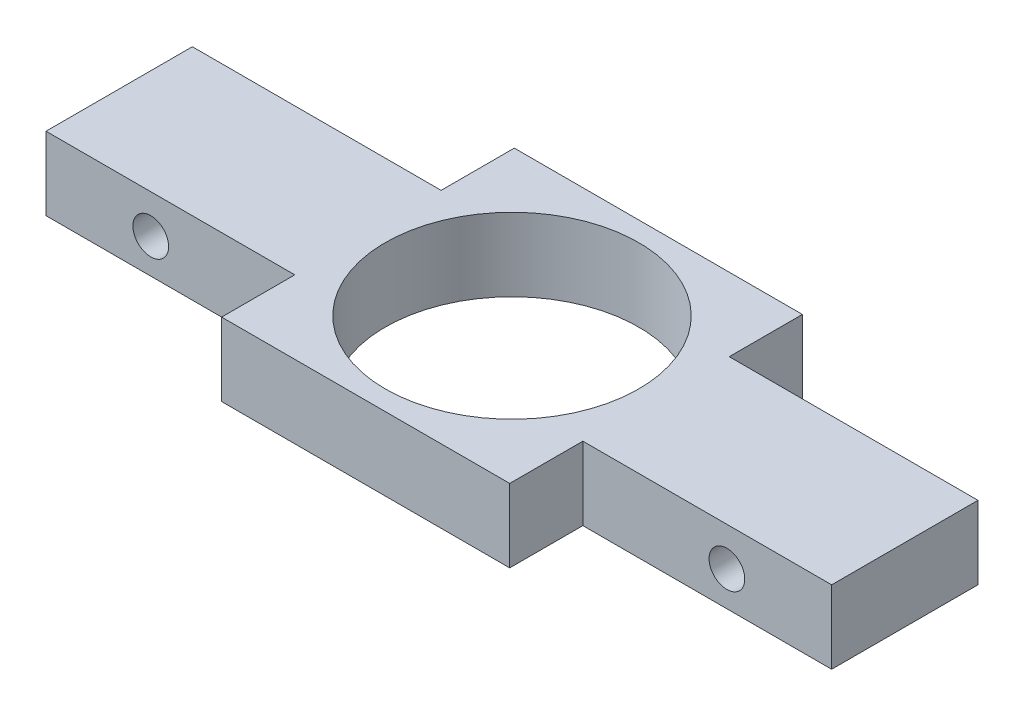
ISO-10303-21;
HEADER;
FILE_DESCRIPTION(('STEP AP214'),'2;1');
FILE_NAME('part.step','',(''),(''),'','','');
FILE_SCHEMA(('AUTOMOTIVE_DESIGN { 1 0 10303 214 1 1 1 1 }'));
ENDSEC;
DATA;
#1=APPLICATION_CONTEXT('core data for automotive mechanical design processes');
#2=APPLICATION_PROTOCOL_DEFINITION('international standard','automotive_design',2000,#1);
#3=PRODUCT_CONTEXT('',#1,'mechanical');
#4=PRODUCT('Part','Part','',(#3));
#5=PRODUCT_RELATED_PRODUCT_CATEGORY('part','',(#4));
#6=PRODUCT_DEFINITION_FORMATION('','',#4);
#7=PRODUCT_DEFINITION_CONTEXT('part definition',#1,'design');
#8=PRODUCT_DEFINITION('design','',#6,#7);
#9=PRODUCT_DEFINITION_SHAPE('','',#8);
#10=(LENGTH_UNIT() NAMED_UNIT(*) SI_UNIT(.MILLI.,.METRE.));
#11=(NAMED_UNIT(*) PLANE_ANGLE_UNIT() SI_UNIT($,.RADIAN.));
#12=(NAMED_UNIT(*) SI_UNIT($,.STERADIAN.) SOLID_ANGLE_UNIT());
#13=UNCERTAINTY_MEASURE_WITH_UNIT(LENGTH_MEASURE(1.E-05),#10,'distance_accuracy_value','');
#14=(GEOMETRIC_REPRESENTATION_CONTEXT(3) GLOBAL_UNCERTAINTY_ASSIGNED_CONTEXT((#13)) GLOBAL_UNIT_ASSIGNED_CONTEXT((#10,
#11,#12)) REPRESENTATION_CONTEXT('',''));
#15=CARTESIAN_POINT('',(0.,0.,0.));
#16=DIRECTION('',(0.,0.,1.));
#17=DIRECTION('',(1.,0.,0.));
#18=AXIS2_PLACEMENT_3D('',#15,#16,#17);
#19=CARTESIAN_POINT('',(0.,6.35,0.));
#20=DIRECTION('',(0.,1.,0.));
#21=DIRECTION('',(0.,0.,1.));
#22=AXIS2_PLACEMENT_3D('',#19,#20,#21);
#23=PLANE('',#22);
#24=DIRECTION('',(0.,0.,1.));
#25=VECTOR('',#24,1.);
#26=CARTESIAN_POINT('',(-34.09,6.35,-6.35));
#27=LINE('',#26,#25);
#28=CARTESIAN_POINT('',(-34.09,6.35,-6.35));
#29=VERTEX_POINT('',#28);
#30=CARTESIAN_POINT('',(-34.09,6.35,6.35));
#31=VERTEX_POINT('',#30);
#32=EDGE_CURVE('E179',#29,#31,#27,.T.);
#33=ORIENTED_EDGE('',*,*,#32,.T.);
#34=DIRECTION('',(1.,0.,0.));
#35=VECTOR('',#34,1.);
#36=CARTESIAN_POINT('',(-34.09,6.35,6.35));
#37=LINE('',#36,#35);
#38=CARTESIAN_POINT('',(-12.5,6.35,6.35));
#39=VERTEX_POINT('',#38);
#40=EDGE_CURVE('E107',#31,#39,#37,.T.);
#41=ORIENTED_EDGE('',*,*,#40,.T.);
#42=DIRECTION('',(0.,0.,1.));
#43=VECTOR('',#42,1.);
#44=CARTESIAN_POINT('',(-12.5,6.35,6.35));
#45=LINE('',#44,#43);
#46=CARTESIAN_POINT('',(-12.5,6.35,12.7));
#47=VERTEX_POINT('',#46);
#48=EDGE_CURVE('E223',#39,#47,#45,.T.);
#49=ORIENTED_EDGE('',*,*,#48,.T.);
#50=DIRECTION('',(1.,0.,0.));
#51=VECTOR('',#50,1.);
#52=CARTESIAN_POINT('',(-12.5,6.35,12.7));
#53=LINE('',#52,#51);
#54=CARTESIAN_POINT('',(12.5,6.35,12.7));
#55=VERTEX_POINT('',#54);
#56=EDGE_CURVE('E225',#47,#55,#53,.T.);
#57=ORIENTED_EDGE('',*,*,#56,.T.);
#58=DIRECTION('',(0.,0.,-1.));
#59=VECTOR('',#58,1.);
#60=CARTESIAN_POINT('',(12.5,6.35,12.7));
#61=LINE('',#60,#59);
#62=CARTESIAN_POINT('',(12.5,6.35,6.35));
#63=VERTEX_POINT('',#62);
#64=EDGE_CURVE('E227',#55,#63,#61,.T.);
#65=ORIENTED_EDGE('',*,*,#64,.T.);
#66=DIRECTION('',(1.,0.,0.));
#67=VECTOR('',#66,1.);
#68=CARTESIAN_POINT('',(12.5,6.35,6.35));
#69=LINE('',#68,#67);
#70=CARTESIAN_POINT('',(34.09,6.35,6.35));
#71=VERTEX_POINT('',#70);
#72=EDGE_CURVE('E229',#63,#71,#69,.T.);
#73=ORIENTED_EDGE('',*,*,#72,.T.);
#74=DIRECTION('',(0.,0.,-1.));
#75=VECTOR('',#74,1.);
#76=CARTESIAN_POINT('',(34.09,6.35,6.35));
#77=LINE('',#76,#75);
#78=CARTESIAN_POINT('',(34.09,6.35,-6.35));
#79=VERTEX_POINT('',#78);
#80=EDGE_CURVE('E231',#71,#79,#77,.T.);
#81=ORIENTED_EDGE('',*,*,#80,.T.);
#82=DIRECTION('',(-1.,0.,0.));
#83=VECTOR('',#82,1.);
#84=CARTESIAN_POINT('',(12.5,6.35,-6.35));
#85=LINE('',#84,#83);
#86=CARTESIAN_POINT('',(12.5,6.35,-6.35));
#87=VERTEX_POINT('',#86);
#88=EDGE_CURVE('E233',#79,#87,#85,.T.);
#89=ORIENTED_EDGE('',*,*,#88,.T.);
#90=DIRECTION('',(0.,0.,-1.));
#91=VECTOR('',#90,1.);
#92=CARTESIAN_POINT('',(12.5,6.35,-12.7));
#93=LINE('',#92,#91);
#94=CARTESIAN_POINT('',(12.5,6.35,-12.7));
#95=VERTEX_POINT('',#94);
#96=EDGE_CURVE('E138',#87,#95,#93,.T.);
#97=ORIENTED_EDGE('',*,*,#96,.T.);
#98=DIRECTION('',(-1.,0.,0.));
#99=VECTOR('',#98,1.);
#100=CARTESIAN_POINT('',(-12.5,6.35,-12.7));
#101=LINE('',#100,#99);
#102=CARTESIAN_POINT('',(-12.5,6.35,-12.7));
#103=VERTEX_POINT('',#102);
#104=EDGE_CURVE('E132',#95,#103,#101,.T.);
#105=ORIENTED_EDGE('',*,*,#104,.T.);
#106=DIRECTION('',(0.,0.,1.));
#107=VECTOR('',#106,1.);
#108=CARTESIAN_POINT('',(-12.5,6.35,-6.35));
#109=LINE('',#108,#107);
#110=CARTESIAN_POINT('',(-12.5,6.35,-6.35));
#111=VERTEX_POINT('',#110);
#112=EDGE_CURVE('E136',#103,#111,#109,.T.);
#113=ORIENTED_EDGE('',*,*,#112,.T.);
#114=DIRECTION('',(-1.,0.,0.));
#115=VECTOR('',#114,1.);
#116=CARTESIAN_POINT('',(-34.09,6.35,-6.35));
#117=LINE('',#116,#115);
#118=EDGE_CURVE('E52',#111,#29,#117,.T.);
#119=ORIENTED_EDGE('',*,*,#118,.T.);
#120=EDGE_LOOP('',(#33,#41,#49,#57,#65,#73,#81,#89,#97,#105,#113,#119));
#121=FACE_BOUND('',#120,.T.);
#122=CARTESIAN_POINT('',(0.,6.35,0.));
#123=DIRECTION('',(0.,1.,0.));
#124=DIRECTION('',(0.,0.,1.));
#125=AXIS2_PLACEMENT_3D('',#122,#123,#124);
#126=CIRCLE('',#125,11.);
#127=CARTESIAN_POINT('',(0.,6.35,11.));
#128=VERTEX_POINT('',#127);
#129=EDGE_CURVE('E160',#128,#128,#126,.T.);
#130=ORIENTED_EDGE('',*,*,#129,.F.);
#131=EDGE_LOOP('',(#130));
#132=FACE_BOUND('',#131,.T.);
#133=ADVANCED_FACE('F33',(#121,#132),#23,.T.);
#134=CARTESIAN_POINT('',(0.,0.,0.));
#135=DIRECTION('',(0.,1.,0.));
#136=DIRECTION('',(0.,0.,1.));
#137=AXIS2_PLACEMENT_3D('',#134,#135,#136);
#138=PLANE('',#137);
#139=DIRECTION('',(0.,0.,1.));
#140=VECTOR('',#139,1.);
#141=CARTESIAN_POINT('',(-34.09,0.,-6.35));
#142=LINE('',#141,#140);
#143=CARTESIAN_POINT('',(-34.09,0.,-6.35));
#144=VERTEX_POINT('',#143);
#145=CARTESIAN_POINT('',(-34.09,0.,6.35));
#146=VERTEX_POINT('',#145);
#147=EDGE_CURVE('E156',#144,#146,#142,.T.);
#148=ORIENTED_EDGE('',*,*,#147,.F.);
#149=DIRECTION('',(-1.,0.,0.));
#150=VECTOR('',#149,1.);
#151=CARTESIAN_POINT('',(-34.09,0.,-6.35));
#152=LINE('',#151,#150);
#153=CARTESIAN_POINT('',(-12.5,0.,-6.35));
#154=VERTEX_POINT('',#153);
#155=EDGE_CURVE('E99',#154,#144,#152,.T.);
#156=ORIENTED_EDGE('',*,*,#155,.F.);
#157=DIRECTION('',(0.,0.,1.));
#158=VECTOR('',#157,1.);
#159=CARTESIAN_POINT('',(-12.5,0.,-6.35));
#160=LINE('',#159,#158);
#161=CARTESIAN_POINT('',(-12.5,0.,-12.7));
#162=VERTEX_POINT('',#161);
#163=EDGE_CURVE('E93',#162,#154,#160,.T.);
#164=ORIENTED_EDGE('',*,*,#163,.F.);
#165=DIRECTION('',(-1.,0.,0.));
#166=VECTOR('',#165,1.);
#167=CARTESIAN_POINT('',(-12.5,0.,-12.7));
#168=LINE('',#167,#166);
#169=CARTESIAN_POINT('',(12.5,0.,-12.7));
#170=VERTEX_POINT('',#169);
#171=EDGE_CURVE('E146',#170,#162,#168,.T.);
#172=ORIENTED_EDGE('',*,*,#171,.F.);
#173=DIRECTION('',(0.,0.,-1.));
#174=VECTOR('',#173,1.);
#175=CARTESIAN_POINT('',(12.5,0.,-12.7));
#176=LINE('',#175,#174);
#177=CARTESIAN_POINT('',(12.5,0.,-6.35));
#178=VERTEX_POINT('',#177);
#179=EDGE_CURVE('E174',#178,#170,#176,.T.);
#180=ORIENTED_EDGE('',*,*,#179,.F.);
#181=DIRECTION('',(-1.,0.,0.));
#182=VECTOR('',#181,1.);
#183=CARTESIAN_POINT('',(12.5,0.,-6.35));
#184=LINE('',#183,#182);
#185=CARTESIAN_POINT('',(34.09,0.,-6.35));
#186=VERTEX_POINT('',#185);
#187=EDGE_CURVE('E172',#186,#178,#184,.T.);
#188=ORIENTED_EDGE('',*,*,#187,.F.);
#189=DIRECTION('',(0.,0.,-1.));
#190=VECTOR('',#189,1.);
#191=CARTESIAN_POINT('',(34.09,0.,6.35));
#192=LINE('',#191,#190);
#193=CARTESIAN_POINT('',(34.09,0.,6.35));
#194=VERTEX_POINT('',#193);
#195=EDGE_CURVE('E170',#194,#186,#192,.T.);
#196=ORIENTED_EDGE('',*,*,#195,.F.);
#197=DIRECTION('',(1.,0.,0.));
#198=VECTOR('',#197,1.);
#199=CARTESIAN_POINT('',(12.5,0.,6.35));
#200=LINE('',#199,#198);
#201=CARTESIAN_POINT('',(12.5,0.,6.35));
#202=VERTEX_POINT('',#201);
#203=EDGE_CURVE('E168',#202,#194,#200,.T.);
#204=ORIENTED_EDGE('',*,*,#203,.F.);
#205=DIRECTION('',(0.,0.,-1.));
#206=VECTOR('',#205,1.);
#207=CARTESIAN_POINT('',(12.5,0.,12.7));
#208=LINE('',#207,#206);
#209=CARTESIAN_POINT('',(12.5,0.,12.7));
#210=VERTEX_POINT('',#209);
#211=EDGE_CURVE('E166',#210,#202,#208,.T.);
#212=ORIENTED_EDGE('',*,*,#211,.F.);
#213=DIRECTION('',(1.,0.,0.));
#214=VECTOR('',#213,1.);
#215=CARTESIAN_POINT('',(-12.5,0.,12.7));
#216=LINE('',#215,#214);
#217=CARTESIAN_POINT('',(-12.5,0.,12.7));
#218=VERTEX_POINT('',#217);
#219=EDGE_CURVE('E164',#218,#210,#216,.T.);
#220=ORIENTED_EDGE('',*,*,#219,.F.);
#221=DIRECTION('',(0.,0.,1.));
#222=VECTOR('',#221,1.);
#223=CARTESIAN_POINT('',(-12.5,0.,6.35));
#224=LINE('',#223,#222);
#225=CARTESIAN_POINT('',(-12.5,0.,6.35));
#226=VERTEX_POINT('',#225);
#227=EDGE_CURVE('E162',#226,#218,#224,.T.);
#228=ORIENTED_EDGE('',*,*,#227,.F.);
#229=DIRECTION('',(1.,0.,0.));
#230=VECTOR('',#229,1.);
#231=CARTESIAN_POINT('',(-34.09,0.,6.35));
#232=LINE('',#231,#230);
#233=EDGE_CURVE('E159',#146,#226,#232,.T.);
#234=ORIENTED_EDGE('',*,*,#233,.F.);
#235=EDGE_LOOP('',(#148,#156,#164,#172,#180,#188,#196,#204,#212,#220,#228,#234));
#236=FACE_BOUND('',#235,.T.);
#237=CARTESIAN_POINT('',(0.,0.,0.));
#238=DIRECTION('',(0.,1.,0.));
#239=DIRECTION('',(0.,0.,1.));
#240=AXIS2_PLACEMENT_3D('',#237,#238,#239);
#241=CIRCLE('',#240,11.);
#242=CARTESIAN_POINT('',(0.,0.,11.));
#243=VERTEX_POINT('',#242);
#244=EDGE_CURVE('E216',#243,#243,#241,.T.);
#245=ORIENTED_EDGE('',*,*,#244,.T.);
#246=EDGE_LOOP('',(#245));
#247=FACE_BOUND('',#246,.T.);
#248=ADVANCED_FACE('F246',(#236,#247),#138,.F.);
#249=CARTESIAN_POINT('',(-34.09,6.35,-6.35));
#250=DIRECTION('',(1.,0.,0.));
#251=DIRECTION('',(0.,0.,-1.));
#252=AXIS2_PLACEMENT_3D('',#249,#250,#251);
#253=PLANE('',#252);
#254=ORIENTED_EDGE('',*,*,#147,.T.);
#255=DIRECTION('',(0.,-1.,0.));
#256=VECTOR('',#255,1.);
#257=CARTESIAN_POINT('',(-34.09,6.35,6.35));
#258=LINE('',#257,#256);
#259=EDGE_CURVE('E11',#31,#146,#258,.T.);
#260=ORIENTED_EDGE('',*,*,#259,.F.);
#261=ORIENTED_EDGE('',*,*,#32,.F.);
#262=DIRECTION('',(0.,-1.,0.));
#263=VECTOR('',#262,1.);
#264=CARTESIAN_POINT('',(-34.09,6.35,-6.35));
#265=LINE('',#264,#263);
#266=EDGE_CURVE('E152',#29,#144,#265,.T.);
#267=ORIENTED_EDGE('',*,*,#266,.T.);
#268=EDGE_LOOP('',(#254,#260,#261,#267));
#269=FACE_BOUND('',#268,.T.);
#270=ADVANCED_FACE('F35',(#269),#253,.F.);
#271=CARTESIAN_POINT('',(-34.09,6.35,6.35));
#272=DIRECTION('',(0.,0.,-1.));
#273=DIRECTION('',(-1.,0.,0.));
#274=AXIS2_PLACEMENT_3D('',#271,#272,#273);
#275=PLANE('',#274);
#276=CARTESIAN_POINT('',(-25.,3.,6.35));
#277=DIRECTION('',(0.,0.,-1.));
#278=DIRECTION('',(-1.,0.,0.));
#279=AXIS2_PLACEMENT_3D('',#276,#277,#278);
#280=CIRCLE('',#279,1.55);
#281=CARTESIAN_POINT('',(-26.55,3.,6.35));
#282=VERTEX_POINT('',#281);
#283=EDGE_CURVE('E204',#282,#282,#280,.T.);
#284=ORIENTED_EDGE('',*,*,#283,.T.);
#285=EDGE_LOOP('',(#284));
#286=FACE_BOUND('',#285,.T.);
#287=ORIENTED_EDGE('',*,*,#233,.T.);
#288=DIRECTION('',(0.,-1.,0.));
#289=VECTOR('',#288,1.);
#290=CARTESIAN_POINT('',(-12.5,6.35,6.35));
#291=LINE('',#290,#289);
#292=EDGE_CURVE('E43',#39,#226,#291,.T.);
#293=ORIENTED_EDGE('',*,*,#292,.F.);
#294=ORIENTED_EDGE('',*,*,#40,.F.);
#295=ORIENTED_EDGE('',*,*,#259,.T.);
#296=EDGE_LOOP('',(#287,#293,#294,#295));
#297=FACE_BOUND('',#296,.T.);
#298=ADVANCED_FACE('F371',(#286,#297),#275,.F.);
#299=CARTESIAN_POINT('',(-12.5,6.35,6.35));
#300=DIRECTION('',(1.,0.,0.));
#301=DIRECTION('',(0.,0.,-1.));
#302=AXIS2_PLACEMENT_3D('',#299,#300,#301);
#303=PLANE('',#302);
#304=ORIENTED_EDGE('',*,*,#227,.T.);
#305=DIRECTION('',(0.,-1.,0.));
#306=VECTOR('',#305,1.);
#307=CARTESIAN_POINT('',(-12.5,6.35,12.7));
#308=LINE('',#307,#306);
#309=EDGE_CURVE('E198',#47,#218,#308,.T.);
#310=ORIENTED_EDGE('',*,*,#309,.F.);
#311=ORIENTED_EDGE('',*,*,#48,.F.);
#312=ORIENTED_EDGE('',*,*,#292,.T.);
#313=EDGE_LOOP('',(#304,#310,#311,#312));
#314=FACE_BOUND('',#313,.T.);
#315=ADVANCED_FACE('F362',(#314),#303,.F.);
#316=CARTESIAN_POINT('',(-12.5,6.35,12.7));
#317=DIRECTION('',(0.,0.,-1.));
#318=DIRECTION('',(-1.,0.,0.));
#319=AXIS2_PLACEMENT_3D('',#316,#317,#318);
#320=PLANE('',#319);
#321=ORIENTED_EDGE('',*,*,#219,.T.);
#322=DIRECTION('',(0.,-1.,0.));
#323=VECTOR('',#322,1.);
#324=CARTESIAN_POINT('',(12.5,6.35,12.7));
#325=LINE('',#324,#323);
#326=EDGE_CURVE('E195',#55,#210,#325,.T.);
#327=ORIENTED_EDGE('',*,*,#326,.F.);
#328=ORIENTED_EDGE('',*,*,#56,.F.);
#329=ORIENTED_EDGE('',*,*,#309,.T.);
#330=EDGE_LOOP('',(#321,#327,#328,#329));
#331=FACE_BOUND('',#330,.T.);
#332=ADVANCED_FACE('F353',(#331),#320,.F.);
#333=CARTESIAN_POINT('',(12.5,6.35,12.7));
#334=DIRECTION('',(-1.,0.,0.));
#335=DIRECTION('',(0.,0.,1.));
#336=AXIS2_PLACEMENT_3D('',#333,#334,#335);
#337=PLANE('',#336);
#338=ORIENTED_EDGE('',*,*,#211,.T.);
#339=DIRECTION('',(0.,-1.,0.));
#340=VECTOR('',#339,1.);
#341=CARTESIAN_POINT('',(12.5,6.35,6.35));
#342=LINE('',#341,#340);
#343=EDGE_CURVE('E192',#63,#202,#342,.T.);
#344=ORIENTED_EDGE('',*,*,#343,.F.);
#345=ORIENTED_EDGE('',*,*,#64,.F.);
#346=ORIENTED_EDGE('',*,*,#326,.T.);
#347=EDGE_LOOP('',(#338,#344,#345,#346));
#348=FACE_BOUND('',#347,.T.);
#349=ADVANCED_FACE('F345',(#348),#337,.F.);
#350=CARTESIAN_POINT('',(12.5,6.35,6.35));
#351=DIRECTION('',(0.,0.,-1.));
#352=DIRECTION('',(-1.,0.,0.));
#353=AXIS2_PLACEMENT_3D('',#350,#351,#352);
#354=PLANE('',#353);
#355=CARTESIAN_POINT('',(25.,3.,6.35));
#356=DIRECTION('',(0.,0.,-1.));
#357=DIRECTION('',(-1.,0.,0.));
#358=AXIS2_PLACEMENT_3D('',#355,#356,#357);
#359=CIRCLE('',#358,1.55);
#360=CARTESIAN_POINT('',(23.45,3.,6.35));
#361=VERTEX_POINT('',#360);
#362=EDGE_CURVE('E212',#361,#361,#359,.T.);
#363=ORIENTED_EDGE('',*,*,#362,.T.);
#364=EDGE_LOOP('',(#363));
#365=FACE_BOUND('',#364,.T.);
#366=ORIENTED_EDGE('',*,*,#203,.T.);
#367=DIRECTION('',(0.,-1.,0.));
#368=VECTOR('',#367,1.);
#369=CARTESIAN_POINT('',(34.09,6.35,6.35));
#370=LINE('',#369,#368);
#371=EDGE_CURVE('E189',#71,#194,#370,.T.);
#372=ORIENTED_EDGE('',*,*,#371,.F.);
#373=ORIENTED_EDGE('',*,*,#72,.F.);
#374=ORIENTED_EDGE('',*,*,#343,.T.);
#375=EDGE_LOOP('',(#366,#372,#373,#374));
#376=FACE_BOUND('',#375,.T.);
#377=ADVANCED_FACE('F336',(#365,#376),#354,.F.);
#378=CARTESIAN_POINT('',(34.09,6.35,6.35));
#379=DIRECTION('',(-1.,0.,0.));
#380=DIRECTION('',(0.,0.,1.));
#381=AXIS2_PLACEMENT_3D('',#378,#379,#380);
#382=PLANE('',#381);
#383=ORIENTED_EDGE('',*,*,#195,.T.);
#384=DIRECTION('',(0.,-1.,0.));
#385=VECTOR('',#384,1.);
#386=CARTESIAN_POINT('',(34.09,6.35,-6.35));
#387=LINE('',#386,#385);
#388=EDGE_CURVE('E186',#79,#186,#387,.T.);
#389=ORIENTED_EDGE('',*,*,#388,.F.);
#390=ORIENTED_EDGE('',*,*,#80,.F.);
#391=ORIENTED_EDGE('',*,*,#371,.T.);
#392=EDGE_LOOP('',(#383,#389,#390,#391));
#393=FACE_BOUND('',#392,.T.);
#394=ADVANCED_FACE('F327',(#393),#382,.F.);
#395=CARTESIAN_POINT('',(12.5,6.35,-6.35));
#396=DIRECTION('',(0.,0.,1.));
#397=DIRECTION('',(1.,0.,0.));
#398=AXIS2_PLACEMENT_3D('',#395,#396,#397);
#399=PLANE('',#398);
#400=CARTESIAN_POINT('',(25.,3.,-6.35));
#401=DIRECTION('',(0.,0.,1.));
#402=DIRECTION('',(1.,0.,0.));
#403=AXIS2_PLACEMENT_3D('',#400,#401,#402);
#404=CIRCLE('',#403,1.55);
#405=CARTESIAN_POINT('',(26.55,3.,-6.35));
#406=VERTEX_POINT('',#405);
#407=EDGE_CURVE('E37',#406,#406,#404,.T.);
#408=ORIENTED_EDGE('',*,*,#407,.T.);
#409=EDGE_LOOP('',(#408));
#410=FACE_BOUND('',#409,.T.);
#411=ORIENTED_EDGE('',*,*,#187,.T.);
#412=DIRECTION('',(0.,-1.,0.));
#413=VECTOR('',#412,1.);
#414=CARTESIAN_POINT('',(12.5,6.35,-6.35));
#415=LINE('',#414,#413);
#416=EDGE_CURVE('E183',#87,#178,#415,.T.);
#417=ORIENTED_EDGE('',*,*,#416,.F.);
#418=ORIENTED_EDGE('',*,*,#88,.F.);
#419=ORIENTED_EDGE('',*,*,#388,.T.);
#420=EDGE_LOOP('',(#411,#417,#418,#419));
#421=FACE_BOUND('',#420,.T.);
#422=ADVANCED_FACE('F239',(#410,#421),#399,.F.);
#423=CARTESIAN_POINT('',(12.5,6.35,-12.7));
#424=DIRECTION('',(-1.,0.,0.));
#425=DIRECTION('',(0.,0.,1.));
#426=AXIS2_PLACEMENT_3D('',#423,#424,#425);
#427=PLANE('',#426);
#428=ORIENTED_EDGE('',*,*,#179,.T.);
#429=DIRECTION('',(0.,-1.,0.));
#430=VECTOR('',#429,1.);
#431=CARTESIAN_POINT('',(12.5,6.35,-12.7));
#432=LINE('',#431,#430);
#433=EDGE_CURVE('E147',#95,#170,#432,.T.);
#434=ORIENTED_EDGE('',*,*,#433,.F.);
#435=ORIENTED_EDGE('',*,*,#96,.F.);
#436=ORIENTED_EDGE('',*,*,#416,.T.);
#437=EDGE_LOOP('',(#428,#434,#435,#436));
#438=FACE_BOUND('',#437,.T.);
#439=ADVANCED_FACE('F243',(#438),#427,.F.);
#440=CARTESIAN_POINT('',(-12.5,6.35,-12.7));
#441=DIRECTION('',(0.,0.,1.));
#442=DIRECTION('',(1.,0.,0.));
#443=AXIS2_PLACEMENT_3D('',#440,#441,#442);
#444=PLANE('',#443);
#445=ORIENTED_EDGE('',*,*,#171,.T.);
#446=DIRECTION('',(0.,-1.,0.));
#447=VECTOR('',#446,1.);
#448=CARTESIAN_POINT('',(-12.5,6.35,-12.7));
#449=LINE('',#448,#447);
#450=EDGE_CURVE('E143',#103,#162,#449,.T.);
#451=ORIENTED_EDGE('',*,*,#450,.F.);
#452=ORIENTED_EDGE('',*,*,#104,.F.);
#453=ORIENTED_EDGE('',*,*,#433,.T.);
#454=EDGE_LOOP('',(#445,#451,#452,#453));
#455=FACE_BOUND('',#454,.T.);
#456=ADVANCED_FACE('F144',(#455),#444,.F.);
#457=CARTESIAN_POINT('',(-12.5,6.35,-6.35));
#458=DIRECTION('',(1.,0.,0.));
#459=DIRECTION('',(0.,0.,-1.));
#460=AXIS2_PLACEMENT_3D('',#457,#458,#459);
#461=PLANE('',#460);
#462=ORIENTED_EDGE('',*,*,#163,.T.);
#463=DIRECTION('',(0.,-1.,0.));
#464=VECTOR('',#463,1.);
#465=CARTESIAN_POINT('',(-12.5,6.35,-6.35));
#466=LINE('',#465,#464);
#467=EDGE_CURVE('E148',#111,#154,#466,.T.);
#468=ORIENTED_EDGE('',*,*,#467,.F.);
#469=ORIENTED_EDGE('',*,*,#112,.F.);
#470=ORIENTED_EDGE('',*,*,#450,.T.);
#471=EDGE_LOOP('',(#462,#468,#469,#470));
#472=FACE_BOUND('',#471,.T.);
#473=ADVANCED_FACE('F150',(#472),#461,.F.);
#474=CARTESIAN_POINT('',(-34.09,6.35,-6.35));
#475=DIRECTION('',(0.,0.,1.));
#476=DIRECTION('',(1.,0.,0.));
#477=AXIS2_PLACEMENT_3D('',#474,#475,#476);
#478=PLANE('',#477);
#479=CARTESIAN_POINT('',(-25.,3.,-6.35));
#480=DIRECTION('',(0.,0.,1.));
#481=DIRECTION('',(1.,0.,0.));
#482=AXIS2_PLACEMENT_3D('',#479,#480,#481);
#483=CIRCLE('',#482,1.55);
#484=CARTESIAN_POINT('',(-23.45,3.,-6.35));
#485=VERTEX_POINT('',#484);
#486=EDGE_CURVE('E202',#485,#485,#483,.T.);
#487=ORIENTED_EDGE('',*,*,#486,.T.);
#488=EDGE_LOOP('',(#487));
#489=FACE_BOUND('',#488,.T.);
#490=ORIENTED_EDGE('',*,*,#155,.T.);
#491=ORIENTED_EDGE('',*,*,#266,.F.);
#492=ORIENTED_EDGE('',*,*,#118,.F.);
#493=ORIENTED_EDGE('',*,*,#467,.T.);
#494=EDGE_LOOP('',(#490,#491,#492,#493));
#495=FACE_BOUND('',#494,.T.);
#496=ADVANCED_FACE('F252',(#489,#495),#478,.F.);
#497=CARTESIAN_POINT('',(0.,6.35,0.));
#498=DIRECTION('',(0.,-1.,0.));
#499=DIRECTION('',(0.,0.,-1.));
#500=AXIS2_PLACEMENT_3D('',#497,#498,#499);
#501=CYLINDRICAL_SURFACE('',#500,11.);
#502=ORIENTED_EDGE('',*,*,#129,.T.);
#503=EDGE_LOOP('',(#502));
#504=FACE_BOUND('',#503,.T.);
#505=ORIENTED_EDGE('',*,*,#244,.F.);
#506=EDGE_LOOP('',(#505));
#507=FACE_BOUND('',#506,.T.);
#508=ADVANCED_FACE('F254',(#504,#507),#501,.F.);
#509=CARTESIAN_POINT('',(-25.,3.,12.7));
#510=DIRECTION('',(0.,0.,-1.));
#511=DIRECTION('',(-1.,0.,0.));
#512=AXIS2_PLACEMENT_3D('',#509,#510,#511);
#513=CYLINDRICAL_SURFACE('',#512,1.55);
#514=ORIENTED_EDGE('',*,*,#486,.F.);
#515=EDGE_LOOP('',(#514));
#516=FACE_BOUND('',#515,.T.);
#517=ORIENTED_EDGE('',*,*,#283,.F.);
#518=EDGE_LOOP('',(#517));
#519=FACE_BOUND('',#518,.T.);
#520=ADVANCED_FACE('F260',(#516,#519),#513,.F.);
#521=CARTESIAN_POINT('',(25.,3.,12.7));
#522=DIRECTION('',(0.,0.,-1.));
#523=DIRECTION('',(-1.,0.,0.));
#524=AXIS2_PLACEMENT_3D('',#521,#522,#523);
#525=CYLINDRICAL_SURFACE('',#524,1.55);
#526=ORIENTED_EDGE('',*,*,#407,.F.);
#527=EDGE_LOOP('',(#526));
#528=FACE_BOUND('',#527,.T.);
#529=ORIENTED_EDGE('',*,*,#362,.F.);
#530=EDGE_LOOP('',(#529));
#531=FACE_BOUND('',#530,.T.);
#532=ADVANCED_FACE('F271',(#528,#531),#525,.F.);
#533=CLOSED_SHELL('',(#133,#248,#270,#298,#315,#332,#349,#377,#394,#422,#439,#456,#473,#496,
#508,#520,#532));
#534=MANIFOLD_SOLID_BREP('B2',#533);
#535=ADVANCED_BREP_SHAPE_REPRESENTATION('',(#18,#534),#14);
#536=SHAPE_DEFINITION_REPRESENTATION(#9,#535);
ENDSEC;
END-ISO-10303-21;
